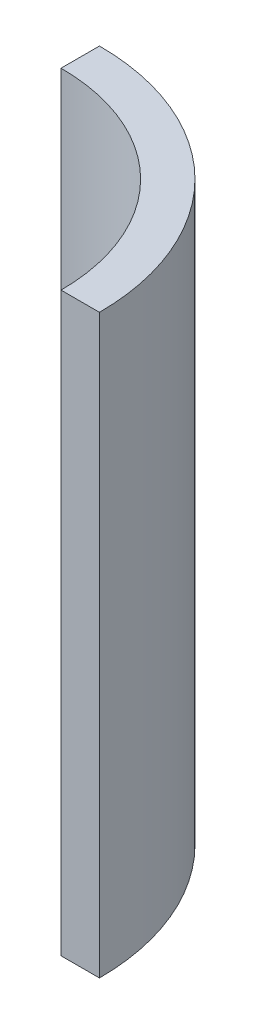
ISO-10303-21;
HEADER;
FILE_DESCRIPTION(('STEP AP214'),'2;1');
FILE_NAME('part.step','',(''),(''),'','','');
FILE_SCHEMA(('AUTOMOTIVE_DESIGN { 1 0 10303 214 1 1 1 1 }'));
ENDSEC;
DATA;
#1=APPLICATION_CONTEXT('core data for automotive mechanical design processes');
#2=APPLICATION_PROTOCOL_DEFINITION('international standard','automotive_design',2000,#1);
#3=PRODUCT_CONTEXT('',#1,'mechanical');
#4=PRODUCT('Part','Part','',(#3));
#5=PRODUCT_RELATED_PRODUCT_CATEGORY('part','',(#4));
#6=PRODUCT_DEFINITION_FORMATION('','',#4);
#7=PRODUCT_DEFINITION_CONTEXT('part definition',#1,'design');
#8=PRODUCT_DEFINITION('design','',#6,#7);
#9=PRODUCT_DEFINITION_SHAPE('','',#8);
#10=(LENGTH_UNIT() NAMED_UNIT(*) SI_UNIT(.MILLI.,.METRE.));
#11=(NAMED_UNIT(*) PLANE_ANGLE_UNIT() SI_UNIT($,.RADIAN.));
#12=(NAMED_UNIT(*) SI_UNIT($,.STERADIAN.) SOLID_ANGLE_UNIT());
#13=UNCERTAINTY_MEASURE_WITH_UNIT(LENGTH_MEASURE(1.E-05),#10,'distance_accuracy_value','');
#14=(GEOMETRIC_REPRESENTATION_CONTEXT(3) GLOBAL_UNCERTAINTY_ASSIGNED_CONTEXT((#13)) GLOBAL_UNIT_ASSIGNED_CONTEXT((#10,
#11,#12)) REPRESENTATION_CONTEXT('',''));
#15=CARTESIAN_POINT('',(0.,0.,0.));
#16=DIRECTION('',(0.,0.,1.));
#17=DIRECTION('',(1.,0.,0.));
#18=AXIS2_PLACEMENT_3D('',#15,#16,#17);
#19=CARTESIAN_POINT('',(0.,150.,0.));
#20=DIRECTION('',(0.,-1.,0.));
#21=DIRECTION('',(0.,0.,-1.));
#22=AXIS2_PLACEMENT_3D('',#19,#20,#21);
#23=CYLINDRICAL_SURFACE('',#22,60.);
#24=CARTESIAN_POINT('',(0.,0.,0.));
#25=DIRECTION('',(0.,1.,0.));
#26=DIRECTION('',(1.,0.,0.));
#27=AXIS2_PLACEMENT_3D('',#24,#25,#26);
#28=CIRCLE('',#27,60.);
#29=CARTESIAN_POINT('',(60.,0.,0.));
#30=VERTEX_POINT('',#29);
#31=CARTESIAN_POINT('',(0.,0.,-60.));
#32=VERTEX_POINT('',#31);
#33=EDGE_CURVE('E111',#30,#32,#28,.T.);
#34=ORIENTED_EDGE('',*,*,#33,.T.);
#35=DIRECTION('',(0.,-1.,0.));
#36=VECTOR('',#35,1.);
#37=CARTESIAN_POINT('',(0.,150.,-60.));
#38=LINE('',#37,#36);
#39=CARTESIAN_POINT('',(0.,150.,-60.));
#40=VERTEX_POINT('',#39);
#41=EDGE_CURVE('E11',#40,#32,#38,.T.);
#42=ORIENTED_EDGE('',*,*,#41,.F.);
#43=CARTESIAN_POINT('',(0.,150.,0.));
#44=DIRECTION('',(0.,1.,0.));
#45=DIRECTION('',(1.,0.,0.));
#46=AXIS2_PLACEMENT_3D('',#43,#44,#45);
#47=CIRCLE('',#46,60.);
#48=CARTESIAN_POINT('',(60.,150.,0.));
#49=VERTEX_POINT('',#48);
#50=EDGE_CURVE('E84',#49,#40,#47,.T.);
#51=ORIENTED_EDGE('',*,*,#50,.F.);
#52=DIRECTION('',(0.,-1.,0.));
#53=VECTOR('',#52,1.);
#54=CARTESIAN_POINT('',(60.,150.,0.));
#55=LINE('',#54,#53);
#56=EDGE_CURVE('E60',#49,#30,#55,.T.);
#57=ORIENTED_EDGE('',*,*,#56,.T.);
#58=EDGE_LOOP('',(#34,#42,#51,#57));
#59=FACE_BOUND('',#58,.T.);
#60=ADVANCED_FACE('F43',(#59),#23,.T.);
#61=CARTESIAN_POINT('',(0.,150.,-50.));
#62=DIRECTION('',(-1.,0.,0.));
#63=DIRECTION('',(0.,0.,1.));
#64=AXIS2_PLACEMENT_3D('',#61,#62,#63);
#65=PLANE('',#64);
#66=DIRECTION('',(0.,0.,-1.));
#67=VECTOR('',#66,1.);
#68=CARTESIAN_POINT('',(0.,0.,-50.));
#69=LINE('',#68,#67);
#70=CARTESIAN_POINT('',(0.,0.,-50.));
#71=VERTEX_POINT('',#70);
#72=EDGE_CURVE('E93',#71,#32,#69,.T.);
#73=ORIENTED_EDGE('',*,*,#72,.F.);
#74=DIRECTION('',(0.,-1.,0.));
#75=VECTOR('',#74,1.);
#76=CARTESIAN_POINT('',(0.,150.,-50.));
#77=LINE('',#76,#75);
#78=CARTESIAN_POINT('',(0.,150.,-50.));
#79=VERTEX_POINT('',#78);
#80=EDGE_CURVE('E52',#79,#71,#77,.T.);
#81=ORIENTED_EDGE('',*,*,#80,.F.);
#82=DIRECTION('',(0.,0.,-1.));
#83=VECTOR('',#82,1.);
#84=CARTESIAN_POINT('',(0.,150.,-50.));
#85=LINE('',#84,#83);
#86=EDGE_CURVE('E91',#79,#40,#85,.T.);
#87=ORIENTED_EDGE('',*,*,#86,.T.);
#88=ORIENTED_EDGE('',*,*,#41,.T.);
#89=EDGE_LOOP('',(#73,#81,#87,#88));
#90=FACE_BOUND('',#89,.T.);
#91=ADVANCED_FACE('F90',(#90),#65,.T.);
#92=CARTESIAN_POINT('',(0.,150.,0.));
#93=DIRECTION('',(0.,-1.,0.));
#94=DIRECTION('',(0.,0.,-1.));
#95=AXIS2_PLACEMENT_3D('',#92,#93,#94);
#96=CYLINDRICAL_SURFACE('',#95,50.);
#97=CARTESIAN_POINT('',(0.,0.,0.));
#98=DIRECTION('',(0.,1.,0.));
#99=DIRECTION('',(0.,0.,1.));
#100=AXIS2_PLACEMENT_3D('',#97,#98,#99);
#101=CIRCLE('',#100,50.);
#102=CARTESIAN_POINT('',(50.,0.,0.));
#103=VERTEX_POINT('',#102);
#104=EDGE_CURVE('E116',#103,#71,#101,.T.);
#105=ORIENTED_EDGE('',*,*,#104,.F.);
#106=DIRECTION('',(0.,-1.,0.));
#107=VECTOR('',#106,1.);
#108=CARTESIAN_POINT('',(50.,150.,0.));
#109=LINE('',#108,#107);
#110=CARTESIAN_POINT('',(50.,150.,0.));
#111=VERTEX_POINT('',#110);
#112=EDGE_CURVE('E73',#111,#103,#109,.T.);
#113=ORIENTED_EDGE('',*,*,#112,.F.);
#114=CARTESIAN_POINT('',(0.,150.,0.));
#115=DIRECTION('',(0.,1.,0.));
#116=DIRECTION('',(0.,0.,1.));
#117=AXIS2_PLACEMENT_3D('',#114,#115,#116);
#118=CIRCLE('',#117,50.);
#119=EDGE_CURVE('E100',#111,#79,#118,.T.);
#120=ORIENTED_EDGE('',*,*,#119,.T.);
#121=ORIENTED_EDGE('',*,*,#80,.T.);
#122=EDGE_LOOP('',(#105,#113,#120,#121));
#123=FACE_BOUND('',#122,.T.);
#124=ADVANCED_FACE('F103',(#123),#96,.F.);
#125=CARTESIAN_POINT('',(60.,150.,0.));
#126=DIRECTION('',(0.,0.,1.));
#127=DIRECTION('',(1.,0.,0.));
#128=AXIS2_PLACEMENT_3D('',#125,#126,#127);
#129=PLANE('',#128);
#130=DIRECTION('',(-1.,0.,0.));
#131=VECTOR('',#130,1.);
#132=CARTESIAN_POINT('',(60.,0.,0.));
#133=LINE('',#132,#131);
#134=EDGE_CURVE('E119',#30,#103,#133,.T.);
#135=ORIENTED_EDGE('',*,*,#134,.F.);
#136=ORIENTED_EDGE('',*,*,#56,.F.);
#137=DIRECTION('',(-1.,0.,0.));
#138=VECTOR('',#137,1.);
#139=CARTESIAN_POINT('',(60.,150.,0.));
#140=LINE('',#139,#138);
#141=EDGE_CURVE('E105',#49,#111,#140,.T.);
#142=ORIENTED_EDGE('',*,*,#141,.T.);
#143=ORIENTED_EDGE('',*,*,#112,.T.);
#144=EDGE_LOOP('',(#135,#136,#142,#143));
#145=FACE_BOUND('',#144,.T.);
#146=ADVANCED_FACE('F129',(#145),#129,.T.);
#147=CARTESIAN_POINT('',(0.,150.,0.));
#148=DIRECTION('',(0.,1.,0.));
#149=DIRECTION('',(1.,0.,0.));
#150=AXIS2_PLACEMENT_3D('',#147,#148,#149);
#151=PLANE('',#150);
#152=ORIENTED_EDGE('',*,*,#50,.T.);
#153=ORIENTED_EDGE('',*,*,#86,.F.);
#154=ORIENTED_EDGE('',*,*,#119,.F.);
#155=ORIENTED_EDGE('',*,*,#141,.F.);
#156=EDGE_LOOP('',(#152,#153,#154,#155));
#157=FACE_BOUND('',#156,.T.);
#158=ADVANCED_FACE('F99',(#157),#151,.T.);
#159=CARTESIAN_POINT('',(0.,0.,0.));
#160=DIRECTION('',(0.,1.,0.));
#161=DIRECTION('',(1.,0.,0.));
#162=AXIS2_PLACEMENT_3D('',#159,#160,#161);
#163=PLANE('',#162);
#164=ORIENTED_EDGE('',*,*,#33,.F.);
#165=ORIENTED_EDGE('',*,*,#134,.T.);
#166=ORIENTED_EDGE('',*,*,#104,.T.);
#167=ORIENTED_EDGE('',*,*,#72,.T.);
#168=EDGE_LOOP('',(#164,#165,#166,#167));
#169=FACE_BOUND('',#168,.T.);
#170=ADVANCED_FACE('F128',(#169),#163,.F.);
#171=CLOSED_SHELL('',(#60,#91,#124,#146,#158,#170));
#172=MANIFOLD_SOLID_BREP('B2',#171);
#173=ADVANCED_BREP_SHAPE_REPRESENTATION('',(#18,#172),#14);
#174=SHAPE_DEFINITION_REPRESENTATION(#9,#173);
ENDSEC;
END-ISO-10303-21;
